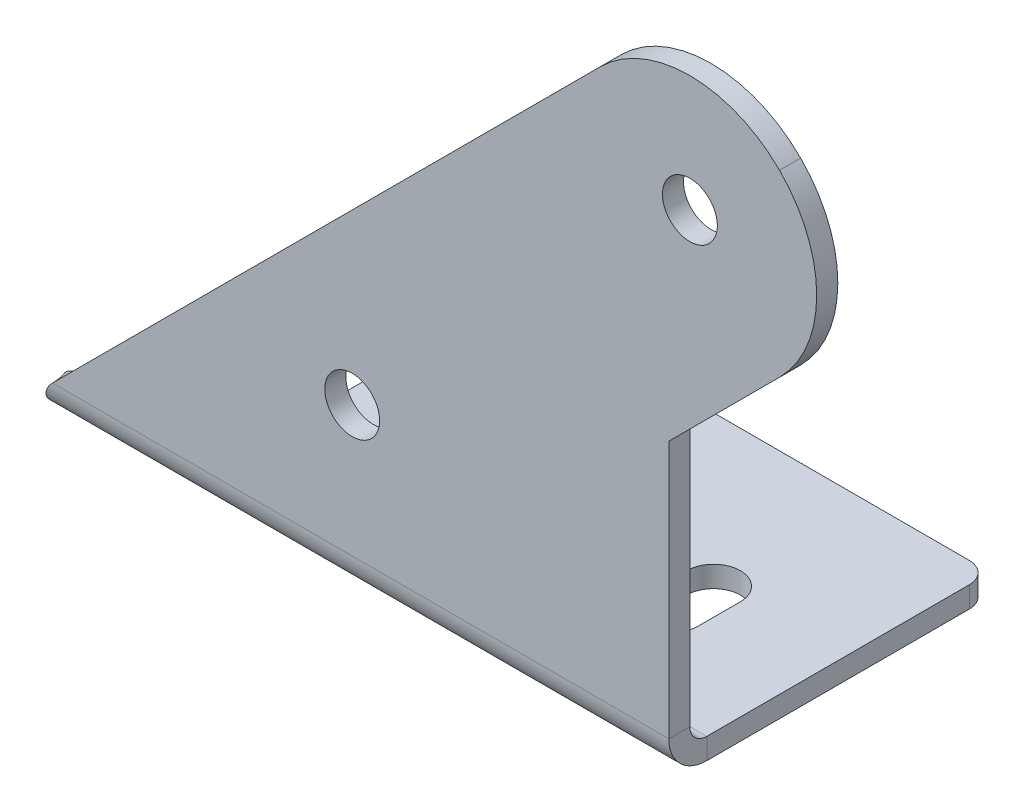
ISO-10303-21;
HEADER;
FILE_DESCRIPTION(('STEP AP214'),'2;1');
FILE_NAME('part.step','',(''),(''),'','','');
FILE_SCHEMA(('AUTOMOTIVE_DESIGN { 1 0 10303 214 1 1 1 1 }'));
ENDSEC;
DATA;
#1=APPLICATION_CONTEXT('core data for automotive mechanical design processes');
#2=APPLICATION_PROTOCOL_DEFINITION('international standard','automotive_design',2000,#1);
#3=PRODUCT_CONTEXT('',#1,'mechanical');
#4=PRODUCT('Part','Part','',(#3));
#5=PRODUCT_RELATED_PRODUCT_CATEGORY('part','',(#4));
#6=PRODUCT_DEFINITION_FORMATION('','',#4);
#7=PRODUCT_DEFINITION_CONTEXT('part definition',#1,'design');
#8=PRODUCT_DEFINITION('design','',#6,#7);
#9=PRODUCT_DEFINITION_SHAPE('','',#8);
#10=(LENGTH_UNIT() NAMED_UNIT(*) SI_UNIT(.MILLI.,.METRE.));
#11=(NAMED_UNIT(*) PLANE_ANGLE_UNIT() SI_UNIT($,.RADIAN.));
#12=(NAMED_UNIT(*) SI_UNIT($,.STERADIAN.) SOLID_ANGLE_UNIT());
#13=UNCERTAINTY_MEASURE_WITH_UNIT(LENGTH_MEASURE(1.E-05),#10,'distance_accuracy_value','');
#14=(GEOMETRIC_REPRESENTATION_CONTEXT(3) GLOBAL_UNCERTAINTY_ASSIGNED_CONTEXT((#13)) GLOBAL_UNIT_ASSIGNED_CONTEXT((#10,
#11,#12)) REPRESENTATION_CONTEXT('',''));
#15=CARTESIAN_POINT('',(0.,0.,0.));
#16=DIRECTION('',(0.,0.,1.));
#17=DIRECTION('',(1.,0.,0.));
#18=AXIS2_PLACEMENT_3D('',#15,#16,#17);
#19=CARTESIAN_POINT('',(45.,-5.,-35.6));
#20=DIRECTION('',(0.,-1.,0.));
#21=DIRECTION('',(0.,0.,-1.));
#22=AXIS2_PLACEMENT_3D('',#19,#20,#21);
#23=CYLINDRICAL_SURFACE('',#22,6.37253144016552);
#24=DIRECTION('',(0.,-1.,0.));
#25=VECTOR('',#24,1.);
#26=CARTESIAN_POINT('',(51.3725314401655,-5.,-35.6));
#27=LINE('',#26,#25);
#28=CARTESIAN_POINT('',(51.3725314401655,0.,-35.6));
#29=VERTEX_POINT('',#28);
#30=CARTESIAN_POINT('',(51.3725314401655,-5.,-35.6));
#31=VERTEX_POINT('',#30);
#32=EDGE_CURVE('E11',#29,#31,#27,.T.);
#33=ORIENTED_EDGE('',*,*,#32,.F.);
#34=CARTESIAN_POINT('',(45.,0.,-35.6));
#35=DIRECTION('',(0.,-1.,0.));
#36=DIRECTION('',(0.,0.,-1.));
#37=AXIS2_PLACEMENT_3D('',#34,#35,#36);
#38=CIRCLE('',#37,6.37253144016552);
#39=CARTESIAN_POINT('',(38.6274685598345,0.,-35.6));
#40=VERTEX_POINT('',#39);
#41=EDGE_CURVE('E150',#40,#29,#38,.T.);
#42=ORIENTED_EDGE('',*,*,#41,.F.);
#43=DIRECTION('',(0.,-1.,0.));
#44=VECTOR('',#43,1.);
#45=CARTESIAN_POINT('',(38.6274685598345,-5.,-35.6));
#46=LINE('',#45,#44);
#47=CARTESIAN_POINT('',(38.6274685598345,-5.,-35.6));
#48=VERTEX_POINT('',#47);
#49=EDGE_CURVE('E51',#40,#48,#46,.T.);
#50=ORIENTED_EDGE('',*,*,#49,.T.);
#51=CARTESIAN_POINT('',(45.,-5.,-35.6));
#52=DIRECTION('',(0.,-1.,0.));
#53=DIRECTION('',(0.,0.,-1.));
#54=AXIS2_PLACEMENT_3D('',#51,#52,#53);
#55=CIRCLE('',#54,6.37253144016552);
#56=EDGE_CURVE('E466',#48,#31,#55,.T.);
#57=ORIENTED_EDGE('',*,*,#56,.T.);
#58=EDGE_LOOP('',(#33,#42,#50,#57));
#59=FACE_BOUND('',#58,.T.);
#60=ADVANCED_FACE('F41',(#59),#23,.F.);
#61=CARTESIAN_POINT('',(38.6274685598345,-5.,-25.6));
#62=DIRECTION('',(1.,0.,0.));
#63=DIRECTION('',(0.,0.,-1.));
#64=AXIS2_PLACEMENT_3D('',#61,#62,#63);
#65=PLANE('',#64);
#66=ORIENTED_EDGE('',*,*,#49,.F.);
#67=DIRECTION('',(0.,0.,1.));
#68=VECTOR('',#67,1.);
#69=CARTESIAN_POINT('',(38.6274685598345,0.,-66.2));
#70=LINE('',#69,#68);
#71=CARTESIAN_POINT('',(38.6274685598345,0.,-25.6));
#72=VERTEX_POINT('',#71);
#73=EDGE_CURVE('E163',#72,#40,#70,.F.);
#74=ORIENTED_EDGE('',*,*,#73,.F.);
#75=DIRECTION('',(0.,-1.,0.));
#76=VECTOR('',#75,1.);
#77=CARTESIAN_POINT('',(38.6274685598345,-5.,-25.6));
#78=LINE('',#77,#76);
#79=CARTESIAN_POINT('',(38.6274685598345,-5.,-25.6));
#80=VERTEX_POINT('',#79);
#81=EDGE_CURVE('E142',#72,#80,#78,.T.);
#82=ORIENTED_EDGE('',*,*,#81,.T.);
#83=DIRECTION('',(0.,0.,-1.));
#84=VECTOR('',#83,1.);
#85=CARTESIAN_POINT('',(38.6274685598345,-5.,-25.6));
#86=LINE('',#85,#84);
#87=EDGE_CURVE('E463',#80,#48,#86,.T.);
#88=ORIENTED_EDGE('',*,*,#87,.T.);
#89=EDGE_LOOP('',(#66,#74,#82,#88));
#90=FACE_BOUND('',#89,.T.);
#91=ADVANCED_FACE('F360',(#90),#65,.T.);
#92=CARTESIAN_POINT('',(45.,-5.,-25.6));
#93=DIRECTION('',(0.,-1.,0.));
#94=DIRECTION('',(0.,0.,-1.));
#95=AXIS2_PLACEMENT_3D('',#92,#93,#94);
#96=CYLINDRICAL_SURFACE('',#95,6.37253144016552);
#97=ORIENTED_EDGE('',*,*,#81,.F.);
#98=CARTESIAN_POINT('',(45.,0.,-25.6));
#99=DIRECTION('',(0.,-1.,0.));
#100=DIRECTION('',(0.,0.,-1.));
#101=AXIS2_PLACEMENT_3D('',#98,#99,#100);
#102=CIRCLE('',#101,6.37253144016552);
#103=CARTESIAN_POINT('',(51.3725314401655,0.,-25.6));
#104=VERTEX_POINT('',#103);
#105=EDGE_CURVE('E148',#104,#72,#102,.T.);
#106=ORIENTED_EDGE('',*,*,#105,.F.);
#107=DIRECTION('',(0.,-1.,0.));
#108=VECTOR('',#107,1.);
#109=CARTESIAN_POINT('',(51.3725314401655,-5.,-25.6));
#110=LINE('',#109,#108);
#111=CARTESIAN_POINT('',(51.3725314401655,-5.,-25.6));
#112=VERTEX_POINT('',#111);
#113=EDGE_CURVE('E45',#104,#112,#110,.T.);
#114=ORIENTED_EDGE('',*,*,#113,.T.);
#115=CARTESIAN_POINT('',(45.,-5.,-25.6));
#116=DIRECTION('',(0.,-1.,0.));
#117=DIRECTION('',(0.,0.,-1.));
#118=AXIS2_PLACEMENT_3D('',#115,#116,#117);
#119=CIRCLE('',#118,6.37253144016552);
#120=EDGE_CURVE('E469',#112,#80,#119,.T.);
#121=ORIENTED_EDGE('',*,*,#120,.T.);
#122=EDGE_LOOP('',(#97,#106,#114,#121));
#123=FACE_BOUND('',#122,.T.);
#124=ADVANCED_FACE('F152',(#123),#96,.F.);
#125=CARTESIAN_POINT('',(-45.,-5.,-35.6));
#126=DIRECTION('',(0.,-1.,0.));
#127=DIRECTION('',(0.,0.,-1.));
#128=AXIS2_PLACEMENT_3D('',#125,#126,#127);
#129=CYLINDRICAL_SURFACE('',#128,6.51840468515784);
#130=DIRECTION('',(0.,-1.,0.));
#131=VECTOR('',#130,1.);
#132=CARTESIAN_POINT('',(-38.4815953148422,-5.,-35.6));
#133=LINE('',#132,#131);
#134=CARTESIAN_POINT('',(-38.4815953148422,0.,-35.6));
#135=VERTEX_POINT('',#134);
#136=CARTESIAN_POINT('',(-38.4815953148422,-5.,-35.6));
#137=VERTEX_POINT('',#136);
#138=EDGE_CURVE('E143',#135,#137,#133,.T.);
#139=ORIENTED_EDGE('',*,*,#138,.F.);
#140=CARTESIAN_POINT('',(-45.,0.,-35.6));
#141=DIRECTION('',(0.,-1.,0.));
#142=DIRECTION('',(0.,0.,-1.));
#143=AXIS2_PLACEMENT_3D('',#140,#141,#142);
#144=CIRCLE('',#143,6.51840468515784);
#145=CARTESIAN_POINT('',(-51.5184046851578,0.,-35.6));
#146=VERTEX_POINT('',#145);
#147=EDGE_CURVE('E410',#146,#135,#144,.T.);
#148=ORIENTED_EDGE('',*,*,#147,.F.);
#149=DIRECTION('',(0.,-1.,0.));
#150=VECTOR('',#149,1.);
#151=CARTESIAN_POINT('',(-51.5184046851578,-5.,-35.6));
#152=LINE('',#151,#150);
#153=CARTESIAN_POINT('',(-51.5184046851578,-5.,-35.6));
#154=VERTEX_POINT('',#153);
#155=EDGE_CURVE('E396',#146,#154,#152,.T.);
#156=ORIENTED_EDGE('',*,*,#155,.T.);
#157=CARTESIAN_POINT('',(-45.,-5.,-35.6));
#158=DIRECTION('',(0.,-1.,0.));
#159=DIRECTION('',(0.,0.,-1.));
#160=AXIS2_PLACEMENT_3D('',#157,#158,#159);
#161=CIRCLE('',#160,6.51840468515784);
#162=EDGE_CURVE('E485',#154,#137,#161,.T.);
#163=ORIENTED_EDGE('',*,*,#162,.T.);
#164=EDGE_LOOP('',(#139,#148,#156,#163));
#165=FACE_BOUND('',#164,.T.);
#166=ADVANCED_FACE('F369',(#165),#129,.F.);
#167=CARTESIAN_POINT('',(-51.5184046851578,-5.,-25.6));
#168=DIRECTION('',(1.,0.,0.));
#169=DIRECTION('',(0.,0.,-1.));
#170=AXIS2_PLACEMENT_3D('',#167,#168,#169);
#171=PLANE('',#170);
#172=ORIENTED_EDGE('',*,*,#155,.F.);
#173=DIRECTION('',(0.,0.,1.));
#174=VECTOR('',#173,1.);
#175=CARTESIAN_POINT('',(-51.5184046851578,0.,-66.2));
#176=LINE('',#175,#174);
#177=CARTESIAN_POINT('',(-51.5184046851578,0.,-25.6));
#178=VERTEX_POINT('',#177);
#179=EDGE_CURVE('E404',#178,#146,#176,.F.);
#180=ORIENTED_EDGE('',*,*,#179,.F.);
#181=DIRECTION('',(0.,-1.,0.));
#182=VECTOR('',#181,1.);
#183=CARTESIAN_POINT('',(-51.5184046851578,-5.,-25.6));
#184=LINE('',#183,#182);
#185=CARTESIAN_POINT('',(-51.5184046851578,-5.,-25.6));
#186=VERTEX_POINT('',#185);
#187=EDGE_CURVE('E386',#178,#186,#184,.T.);
#188=ORIENTED_EDGE('',*,*,#187,.T.);
#189=DIRECTION('',(0.,0.,-1.));
#190=VECTOR('',#189,1.);
#191=CARTESIAN_POINT('',(-51.5184046851578,-5.,-25.6));
#192=LINE('',#191,#190);
#193=EDGE_CURVE('E483',#186,#154,#192,.T.);
#194=ORIENTED_EDGE('',*,*,#193,.T.);
#195=EDGE_LOOP('',(#172,#180,#188,#194));
#196=FACE_BOUND('',#195,.T.);
#197=ADVANCED_FACE('F375',(#196),#171,.T.);
#198=CARTESIAN_POINT('',(-45.,-5.,-25.6));
#199=DIRECTION('',(0.,-1.,0.));
#200=DIRECTION('',(0.,0.,-1.));
#201=AXIS2_PLACEMENT_3D('',#198,#199,#200);
#202=CYLINDRICAL_SURFACE('',#201,6.51840468515784);
#203=ORIENTED_EDGE('',*,*,#187,.F.);
#204=CARTESIAN_POINT('',(-45.,0.,-25.6));
#205=DIRECTION('',(0.,-1.,0.));
#206=DIRECTION('',(0.,0.,-1.));
#207=AXIS2_PLACEMENT_3D('',#204,#205,#206);
#208=CIRCLE('',#207,6.51840468515784);
#209=CARTESIAN_POINT('',(-38.4815953148422,0.,-25.6));
#210=VERTEX_POINT('',#209);
#211=EDGE_CURVE('E389',#210,#178,#208,.T.);
#212=ORIENTED_EDGE('',*,*,#211,.F.);
#213=DIRECTION('',(0.,-1.,0.));
#214=VECTOR('',#213,1.);
#215=CARTESIAN_POINT('',(-38.4815953148422,-5.,-25.6));
#216=LINE('',#215,#214);
#217=CARTESIAN_POINT('',(-38.4815953148422,-5.,-25.6));
#218=VERTEX_POINT('',#217);
#219=EDGE_CURVE('E397',#210,#218,#216,.T.);
#220=ORIENTED_EDGE('',*,*,#219,.T.);
#221=CARTESIAN_POINT('',(-45.,-5.,-25.6));
#222=DIRECTION('',(0.,-1.,0.));
#223=DIRECTION('',(0.,0.,-1.));
#224=AXIS2_PLACEMENT_3D('',#221,#222,#223);
#225=CIRCLE('',#224,6.51840468515784);
#226=EDGE_CURVE('E392',#218,#186,#225,.T.);
#227=ORIENTED_EDGE('',*,*,#226,.T.);
#228=EDGE_LOOP('',(#203,#212,#220,#227));
#229=FACE_BOUND('',#228,.T.);
#230=ADVANCED_FACE('F358',(#229),#202,.F.);
#231=CARTESIAN_POINT('',(-75.,-5.,-66.2));
#232=DIRECTION('',(1.,0.,0.));
#233=DIRECTION('',(0.,0.,-1.));
#234=AXIS2_PLACEMENT_3D('',#231,#232,#233);
#235=PLANE('',#234);
#236=CARTESIAN_POINT('',(-75.,0.,-4.));
#237=CARTESIAN_POINT('',(-75.,-5.,-4.00000000000001));
#238=B_SPLINE_CURVE_WITH_KNOTS('',1,(#236,#237),.UNSPECIFIED.,.F.,.F.,(2,2),(0.,1.),.UNSPECIFIED.);
#239=CARTESIAN_POINT('',(-75.,0.,-4.));
#240=VERTEX_POINT('',#239);
#241=CARTESIAN_POINT('',(-75.,-5.,-4.));
#242=VERTEX_POINT('',#241);
#243=EDGE_CURVE('E289',#240,#242,#238,.T.);
#244=ORIENTED_EDGE('',*,*,#243,.F.);
#245=DIRECTION('',(0.,0.,1.));
#246=VECTOR('',#245,1.);
#247=CARTESIAN_POINT('',(-75.,0.,-66.2));
#248=LINE('',#247,#246);
#249=CARTESIAN_POINT('',(-75.,0.,-66.2));
#250=VERTEX_POINT('',#249);
#251=EDGE_CURVE('E174',#240,#250,#248,.F.);
#252=ORIENTED_EDGE('',*,*,#251,.T.);
#253=DIRECTION('',(0.,-1.,0.));
#254=VECTOR('',#253,1.);
#255=CARTESIAN_POINT('',(-75.,-5.,-66.2));
#256=LINE('',#255,#254);
#257=CARTESIAN_POINT('',(-75.,-5.,-66.2));
#258=VERTEX_POINT('',#257);
#259=EDGE_CURVE('E540',#250,#258,#256,.T.);
#260=ORIENTED_EDGE('',*,*,#259,.T.);
#261=DIRECTION('',(0.,0.,-1.));
#262=VECTOR('',#261,1.);
#263=CARTESIAN_POINT('',(-75.,-5.,-66.2));
#264=LINE('',#263,#262);
#265=EDGE_CURVE('E185',#242,#258,#264,.T.);
#266=ORIENTED_EDGE('',*,*,#265,.F.);
#267=EDGE_LOOP('',(#244,#252,#260,#266));
#268=FACE_BOUND('',#267,.T.);
#269=ADVANCED_FACE('F259',(#268),#235,.F.);
#270=CARTESIAN_POINT('',(-70.,-5.,-66.2));
#271=DIRECTION('',(0.,-1.,0.));
#272=DIRECTION('',(0.,0.,-1.));
#273=AXIS2_PLACEMENT_3D('',#270,#271,#272);
#274=CYLINDRICAL_SURFACE('',#273,5.);
#275=ORIENTED_EDGE('',*,*,#259,.F.);
#276=CARTESIAN_POINT('',(-70.,0.,-66.2));
#277=DIRECTION('',(0.,-1.,0.));
#278=DIRECTION('',(0.,0.,-1.));
#279=AXIS2_PLACEMENT_3D('',#276,#277,#278);
#280=CIRCLE('',#279,5.);
#281=CARTESIAN_POINT('',(-70.,0.,-71.2));
#282=VERTEX_POINT('',#281);
#283=EDGE_CURVE('E177',#250,#282,#280,.T.);
#284=ORIENTED_EDGE('',*,*,#283,.T.);
#285=DIRECTION('',(0.,-1.,0.));
#286=VECTOR('',#285,1.);
#287=CARTESIAN_POINT('',(-70.,-5.,-71.2));
#288=LINE('',#287,#286);
#289=CARTESIAN_POINT('',(-70.,-5.,-71.2));
#290=VERTEX_POINT('',#289);
#291=EDGE_CURVE('E588',#282,#290,#288,.T.);
#292=ORIENTED_EDGE('',*,*,#291,.T.);
#293=CARTESIAN_POINT('',(-70.,-5.,-66.2));
#294=DIRECTION('',(0.,-1.,0.));
#295=DIRECTION('',(0.,0.,1.));
#296=AXIS2_PLACEMENT_3D('',#293,#294,#295);
#297=CIRCLE('',#296,5.);
#298=EDGE_CURVE('E477',#258,#290,#297,.T.);
#299=ORIENTED_EDGE('',*,*,#298,.F.);
#300=EDGE_LOOP('',(#275,#284,#292,#299));
#301=FACE_BOUND('',#300,.T.);
#302=ADVANCED_FACE('F351',(#301),#274,.T.);
#303=CARTESIAN_POINT('',(-70.,-5.,-71.2));
#304=DIRECTION('',(0.,0.,1.));
#305=DIRECTION('',(1.,0.,0.));
#306=AXIS2_PLACEMENT_3D('',#303,#304,#305);
#307=PLANE('',#306);
#308=ORIENTED_EDGE('',*,*,#291,.F.);
#309=DIRECTION('',(1.,0.,0.));
#310=VECTOR('',#309,1.);
#311=CARTESIAN_POINT('',(-70.,0.,-71.2));
#312=LINE('',#311,#310);
#313=CARTESIAN_POINT('',(70.,0.,-71.2));
#314=VERTEX_POINT('',#313);
#315=EDGE_CURVE('E157',#282,#314,#312,.T.);
#316=ORIENTED_EDGE('',*,*,#315,.T.);
#317=DIRECTION('',(0.,-1.,0.));
#318=VECTOR('',#317,1.);
#319=CARTESIAN_POINT('',(70.,-5.,-71.2));
#320=LINE('',#319,#318);
#321=CARTESIAN_POINT('',(70.,-5.,-71.2));
#322=VERTEX_POINT('',#321);
#323=EDGE_CURVE('E585',#314,#322,#320,.T.);
#324=ORIENTED_EDGE('',*,*,#323,.T.);
#325=DIRECTION('',(1.,0.,0.));
#326=VECTOR('',#325,1.);
#327=CARTESIAN_POINT('',(-70.,-5.,-71.2));
#328=LINE('',#327,#326);
#329=EDGE_CURVE('E474',#290,#322,#328,.T.);
#330=ORIENTED_EDGE('',*,*,#329,.F.);
#331=EDGE_LOOP('',(#308,#316,#324,#330));
#332=FACE_BOUND('',#331,.T.);
#333=ADVANCED_FACE('F348',(#332),#307,.F.);
#334=CARTESIAN_POINT('',(70.,-5.,-66.2));
#335=DIRECTION('',(0.,-1.,0.));
#336=DIRECTION('',(0.,0.,-1.));
#337=AXIS2_PLACEMENT_3D('',#334,#335,#336);
#338=CYLINDRICAL_SURFACE('',#337,5.);
#339=ORIENTED_EDGE('',*,*,#323,.F.);
#340=CARTESIAN_POINT('',(70.,0.,-66.2));
#341=DIRECTION('',(0.,-1.,0.));
#342=DIRECTION('',(0.,0.,-1.));
#343=AXIS2_PLACEMENT_3D('',#340,#341,#342);
#344=CIRCLE('',#343,5.);
#345=CARTESIAN_POINT('',(75.,0.,-66.2));
#346=VERTEX_POINT('',#345);
#347=EDGE_CURVE('E154',#314,#346,#344,.T.);
#348=ORIENTED_EDGE('',*,*,#347,.T.);
#349=DIRECTION('',(0.,-1.,0.));
#350=VECTOR('',#349,1.);
#351=CARTESIAN_POINT('',(75.,-5.,-66.2));
#352=LINE('',#351,#350);
#353=CARTESIAN_POINT('',(75.,-5.,-66.2));
#354=VERTEX_POINT('',#353);
#355=EDGE_CURVE('E583',#346,#354,#352,.T.);
#356=ORIENTED_EDGE('',*,*,#355,.T.);
#357=CARTESIAN_POINT('',(70.,-5.,-66.2));
#358=DIRECTION('',(0.,-1.,0.));
#359=DIRECTION('',(0.,0.,-1.));
#360=AXIS2_PLACEMENT_3D('',#357,#358,#359);
#361=CIRCLE('',#360,5.);
#362=EDGE_CURVE('E471',#322,#354,#361,.T.);
#363=ORIENTED_EDGE('',*,*,#362,.F.);
#364=EDGE_LOOP('',(#339,#348,#356,#363));
#365=FACE_BOUND('',#364,.T.);
#366=ADVANCED_FACE('F344',(#365),#338,.T.);
#367=CARTESIAN_POINT('',(75.,-5.,-66.2));
#368=DIRECTION('',(-1.,0.,0.));
#369=DIRECTION('',(0.,0.,1.));
#370=AXIS2_PLACEMENT_3D('',#367,#368,#369);
#371=PLANE('',#370);
#372=ORIENTED_EDGE('',*,*,#355,.F.);
#373=DIRECTION('',(0.,0.,1.));
#374=VECTOR('',#373,1.);
#375=CARTESIAN_POINT('',(75.,0.,-66.2));
#376=LINE('',#375,#374);
#377=CARTESIAN_POINT('',(75.,0.,-4.));
#378=VERTEX_POINT('',#377);
#379=EDGE_CURVE('E178',#346,#378,#376,.T.);
#380=ORIENTED_EDGE('',*,*,#379,.T.);
#381=DIRECTION('',(0.,-1.,0.));
#382=VECTOR('',#381,1.);
#383=CARTESIAN_POINT('',(75.,-5.,-4.));
#384=LINE('',#383,#382);
#385=CARTESIAN_POINT('',(75.,-5.,-4.));
#386=VERTEX_POINT('',#385);
#387=EDGE_CURVE('E581',#378,#386,#384,.T.);
#388=ORIENTED_EDGE('',*,*,#387,.T.);
#389=DIRECTION('',(0.,0.,1.));
#390=VECTOR('',#389,1.);
#391=CARTESIAN_POINT('',(75.,-5.,-66.2));
#392=LINE('',#391,#390);
#393=EDGE_CURVE('E480',#354,#386,#392,.T.);
#394=ORIENTED_EDGE('',*,*,#393,.F.);
#395=EDGE_LOOP('',(#372,#380,#388,#394));
#396=FACE_BOUND('',#395,.T.);
#397=ADVANCED_FACE('F341',(#396),#371,.F.);
#398=CARTESIAN_POINT('',(75.,4.,-4.));
#399=DIRECTION('',(-1.,0.,0.));
#400=DIRECTION('',(0.,0.,1.));
#401=AXIS2_PLACEMENT_3D('',#398,#399,#400);
#402=PLANE('',#401);
#403=ORIENTED_EDGE('',*,*,#387,.F.);
#404=CARTESIAN_POINT('',(75.,4.,-4.));
#405=DIRECTION('',(-1.,0.,0.));
#406=DIRECTION('',(0.,0.,1.));
#407=AXIS2_PLACEMENT_3D('',#404,#405,#406);
#408=CIRCLE('',#407,4.);
#409=CARTESIAN_POINT('',(75.,4.,0.));
#410=VERTEX_POINT('',#409);
#411=EDGE_CURVE('E406',#378,#410,#408,.T.);
#412=ORIENTED_EDGE('',*,*,#411,.T.);
#413=DIRECTION('',(0.,0.,1.));
#414=VECTOR('',#413,1.);
#415=CARTESIAN_POINT('',(75.,4.,5.));
#416=LINE('',#415,#414);
#417=CARTESIAN_POINT('',(75.,4.,5.));
#418=VERTEX_POINT('',#417);
#419=EDGE_CURVE('E59',#410,#418,#416,.T.);
#420=ORIENTED_EDGE('',*,*,#419,.T.);
#421=CARTESIAN_POINT('',(75.,4.,-4.));
#422=DIRECTION('',(1.,0.,0.));
#423=DIRECTION('',(0.,0.,-1.));
#424=AXIS2_PLACEMENT_3D('',#421,#422,#423);
#425=CIRCLE('',#424,9.);
#426=EDGE_CURVE('E438',#386,#418,#425,.F.);
#427=ORIENTED_EDGE('',*,*,#426,.F.);
#428=EDGE_LOOP('',(#403,#412,#420,#427));
#429=FACE_BOUND('',#428,.T.);
#430=ADVANCED_FACE('F337',(#429),#402,.F.);
#431=CARTESIAN_POINT('',(75.,-5.,5.));
#432=DIRECTION('',(-1.,0.,0.));
#433=DIRECTION('',(0.,1.,0.));
#434=AXIS2_PLACEMENT_3D('',#431,#432,#433);
#435=PLANE('',#434);
#436=ORIENTED_EDGE('',*,*,#419,.F.);
#437=DIRECTION('',(0.,1.,0.));
#438=VECTOR('',#437,1.);
#439=CARTESIAN_POINT('',(75.,32.5735931288073,0.));
#440=LINE('',#439,#438);
#441=CARTESIAN_POINT('',(75.,65.0472719955607,0.));
#442=VERTEX_POINT('',#441);
#443=EDGE_CURVE('E229',#410,#442,#440,.T.);
#444=ORIENTED_EDGE('',*,*,#443,.T.);
#445=DIRECTION('',(0.,0.,1.));
#446=VECTOR('',#445,1.);
#447=CARTESIAN_POINT('',(75.,65.0472719955607,5.));
#448=LINE('',#447,#446);
#449=CARTESIAN_POINT('',(75.,65.0472719955607,5.));
#450=VERTEX_POINT('',#449);
#451=EDGE_CURVE('E578',#442,#450,#448,.T.);
#452=ORIENTED_EDGE('',*,*,#451,.T.);
#453=DIRECTION('',(0.,1.,0.));
#454=VECTOR('',#453,1.);
#455=CARTESIAN_POINT('',(75.,-5.,5.));
#456=LINE('',#455,#454);
#457=EDGE_CURVE('E453',#418,#450,#456,.T.);
#458=ORIENTED_EDGE('',*,*,#457,.F.);
#459=EDGE_LOOP('',(#436,#444,#452,#458));
#460=FACE_BOUND('',#459,.T.);
#461=ADVANCED_FACE('F333',(#460),#435,.F.);
#462=CARTESIAN_POINT('',(4.97636400221954,-4.97636400221955,5.));
#463=DIRECTION('',(0.707106781186546,-0.707106781186549,0.));
#464=DIRECTION('',(-0.707106781186549,-0.707106781186546,0.));
#465=AXIS2_PLACEMENT_3D('',#462,#463,#464);
#466=PLANE('',#465);
#467=ORIENTED_EDGE('',*,*,#451,.F.);
#468=DIRECTION('',(-0.707106781186549,-0.707106781186546,0.));
#469=VECTOR('',#468,1.);
#470=CARTESIAN_POINT('',(4.97636400221954,-4.97636400221955,0.));
#471=LINE('',#470,#469);
#472=CARTESIAN_POINT('',(101.263160566622,91.3104325621828,0.));
#473=VERTEX_POINT('',#472);
#474=EDGE_CURVE('E426',#473,#442,#471,.T.);
#475=ORIENTED_EDGE('',*,*,#474,.F.);
#476=DIRECTION('',(0.,0.,1.));
#477=VECTOR('',#476,1.);
#478=CARTESIAN_POINT('',(101.263160566622,91.3104325621828,5.));
#479=LINE('',#478,#477);
#480=CARTESIAN_POINT('',(101.263160566622,91.3104325621828,5.));
#481=VERTEX_POINT('',#480);
#482=EDGE_CURVE('E574',#473,#481,#479,.T.);
#483=ORIENTED_EDGE('',*,*,#482,.T.);
#484=DIRECTION('',(-0.707106781186549,-0.707106781186546,0.));
#485=VECTOR('',#484,1.);
#486=CARTESIAN_POINT('',(4.97636400221954,-4.97636400221955,5.));
#487=LINE('',#486,#485);
#488=EDGE_CURVE('E450',#481,#450,#487,.T.);
#489=ORIENTED_EDGE('',*,*,#488,.T.);
#490=EDGE_LOOP('',(#467,#475,#483,#489));
#491=FACE_BOUND('',#490,.T.);
#492=ADVANCED_FACE('F329',(#491),#466,.T.);
#493=CARTESIAN_POINT('',(80.0499571310259,112.523635997779,5.));
#494=DIRECTION('',(0.,0.,-1.));
#495=DIRECTION('',(-1.,0.,0.));
#496=AXIS2_PLACEMENT_3D('',#493,#494,#495);
#497=CYLINDRICAL_SURFACE('',#496,30.);
#498=ORIENTED_EDGE('',*,*,#482,.F.);
#499=CARTESIAN_POINT('',(80.0499571310259,112.523635997779,0.));
#500=DIRECTION('',(0.,0.,-1.));
#501=DIRECTION('',(-1.,0.,0.));
#502=AXIS2_PLACEMENT_3D('',#499,#500,#501);
#503=CIRCLE('',#502,30.);
#504=CARTESIAN_POINT('',(101.263160566622,133.736839433376,0.));
#505=VERTEX_POINT('',#504);
#506=EDGE_CURVE('E429',#505,#473,#503,.T.);
#507=ORIENTED_EDGE('',*,*,#506,.F.);
#508=DIRECTION('',(0.,0.,1.));
#509=VECTOR('',#508,1.);
#510=CARTESIAN_POINT('',(101.263160566622,133.736839433376,5.));
#511=LINE('',#510,#509);
#512=CARTESIAN_POINT('',(101.263160566622,133.736839433376,5.));
#513=VERTEX_POINT('',#512);
#514=EDGE_CURVE('E572',#505,#513,#511,.T.);
#515=ORIENTED_EDGE('',*,*,#514,.T.);
#516=CARTESIAN_POINT('',(80.0499571310259,112.523635997779,5.));
#517=DIRECTION('',(0.,0.,-1.));
#518=DIRECTION('',(-1.,0.,0.));
#519=AXIS2_PLACEMENT_3D('',#516,#517,#518);
#520=CIRCLE('',#519,30.);
#521=EDGE_CURVE('E447',#513,#481,#520,.T.);
#522=ORIENTED_EDGE('',*,*,#521,.T.);
#523=EDGE_LOOP('',(#498,#507,#515,#522));
#524=FACE_BOUND('',#523,.T.);
#525=ADVANCED_FACE('F325',(#524),#497,.T.);
#526=CARTESIAN_POINT('',(117.499999999999,117.499999999999,5.));
#527=DIRECTION('',(0.707106781186548,0.707106781186548,0.));
#528=DIRECTION('',(0.707106781186548,-0.707106781186548,0.));
#529=AXIS2_PLACEMENT_3D('',#526,#527,#528);
#530=PLANE('',#529);
#531=ORIENTED_EDGE('',*,*,#514,.F.);
#532=DIRECTION('',(0.707106781186548,-0.707106781186548,0.));
#533=VECTOR('',#532,1.);
#534=CARTESIAN_POINT('',(117.499999999999,117.499999999999,0.));
#535=LINE('',#534,#533);
#536=CARTESIAN_POINT('',(101.213203435596,133.786796564402,0.));
#537=VERTEX_POINT('',#536);
#538=EDGE_CURVE('E417',#537,#505,#535,.T.);
#539=ORIENTED_EDGE('',*,*,#538,.F.);
#540=DIRECTION('',(0.,0.,1.));
#541=VECTOR('',#540,1.);
#542=CARTESIAN_POINT('',(101.213203435596,133.786796564402,5.));
#543=LINE('',#542,#541);
#544=CARTESIAN_POINT('',(101.213203435596,133.786796564402,5.));
#545=VERTEX_POINT('',#544);
#546=EDGE_CURVE('E566',#537,#545,#543,.T.);
#547=ORIENTED_EDGE('',*,*,#546,.T.);
#548=DIRECTION('',(0.707106781186548,-0.707106781186548,0.));
#549=VECTOR('',#548,1.);
#550=CARTESIAN_POINT('',(117.499999999999,117.499999999999,5.));
#551=LINE('',#550,#549);
#552=EDGE_CURVE('E444',#545,#513,#551,.T.);
#553=ORIENTED_EDGE('',*,*,#552,.T.);
#554=EDGE_LOOP('',(#531,#539,#547,#553));
#555=FACE_BOUND('',#554,.T.);
#556=ADVANCED_FACE('F321',(#555),#530,.T.);
#557=CARTESIAN_POINT('',(79.9999999999998,112.573593128806,5.));
#558=DIRECTION('',(0.,0.,-1.));
#559=DIRECTION('',(-1.,0.,0.));
#560=AXIS2_PLACEMENT_3D('',#557,#558,#559);
#561=CYLINDRICAL_SURFACE('',#560,30.);
#562=ORIENTED_EDGE('',*,*,#546,.F.);
#563=CARTESIAN_POINT('',(79.9999999999998,112.573593128806,0.));
#564=DIRECTION('',(0.,0.,-1.));
#565=DIRECTION('',(-1.,0.,0.));
#566=AXIS2_PLACEMENT_3D('',#563,#564,#565);
#567=CIRCLE('',#566,30.);
#568=CARTESIAN_POINT('',(58.7867965644033,133.786796564402,0.));
#569=VERTEX_POINT('',#568);
#570=EDGE_CURVE('E230',#569,#537,#567,.T.);
#571=ORIENTED_EDGE('',*,*,#570,.F.);
#572=DIRECTION('',(0.,0.,1.));
#573=VECTOR('',#572,1.);
#574=CARTESIAN_POINT('',(58.7867965644033,133.786796564402,5.));
#575=LINE('',#574,#573);
#576=CARTESIAN_POINT('',(58.7867965644033,133.786796564402,5.));
#577=VERTEX_POINT('',#576);
#578=EDGE_CURVE('E557',#569,#577,#575,.T.);
#579=ORIENTED_EDGE('',*,*,#578,.T.);
#580=CARTESIAN_POINT('',(79.9999999999998,112.573593128806,5.));
#581=DIRECTION('',(0.,0.,-1.));
#582=DIRECTION('',(-1.,0.,0.));
#583=AXIS2_PLACEMENT_3D('',#580,#581,#582);
#584=CIRCLE('',#583,30.);
#585=EDGE_CURVE('E457',#577,#545,#584,.T.);
#586=ORIENTED_EDGE('',*,*,#585,.T.);
#587=EDGE_LOOP('',(#562,#571,#579,#586));
#588=FACE_BOUND('',#587,.T.);
#589=ADVANCED_FACE('F318',(#588),#561,.T.);
#590=CARTESIAN_POINT('',(-75.,0.,5.));
#591=DIRECTION('',(0.707106781186549,-0.707106781186546,0.));
#592=DIRECTION('',(-0.707106781186546,-0.707106781186549,0.));
#593=AXIS2_PLACEMENT_3D('',#590,#591,#592);
#594=PLANE('',#593);
#595=ORIENTED_EDGE('',*,*,#578,.F.);
#596=DIRECTION('',(-0.707106781186546,-0.707106781186549,0.));
#597=VECTOR('',#596,1.);
#598=CARTESIAN_POINT('',(-75.,0.,0.));
#599=LINE('',#598,#597);
#600=CARTESIAN_POINT('',(-71.,4.,0.));
#601=VERTEX_POINT('',#600);
#602=EDGE_CURVE('E226',#569,#601,#599,.T.);
#603=ORIENTED_EDGE('',*,*,#602,.T.);
#604=CARTESIAN_POINT('',(-71.,4.,5.));
#605=CARTESIAN_POINT('',(-71.,4.,0.));
#606=B_SPLINE_CURVE_WITH_KNOTS('',1,(#604,#605),.UNSPECIFIED.,.F.,.F.,(2,2),(0.,1.),.UNSPECIFIED.);
#607=CARTESIAN_POINT('',(-71.,4.,5.));
#608=VERTEX_POINT('',#607);
#609=EDGE_CURVE('E301',#601,#608,#606,.F.);
#610=ORIENTED_EDGE('',*,*,#609,.T.);
#611=DIRECTION('',(-0.707106781186546,-0.707106781186549,0.));
#612=VECTOR('',#611,1.);
#613=CARTESIAN_POINT('',(-75.,0.,5.));
#614=LINE('',#613,#612);
#615=EDGE_CURVE('E456',#577,#608,#614,.T.);
#616=ORIENTED_EDGE('',*,*,#615,.F.);
#617=EDGE_LOOP('',(#595,#603,#610,#616));
#618=FACE_BOUND('',#617,.T.);
#619=ADVANCED_FACE('F307',(#618),#594,.F.);
#620=CARTESIAN_POINT('',(-38.4815953148422,-5.,-25.6));
#621=DIRECTION('',(-1.,0.,0.));
#622=DIRECTION('',(0.,0.,1.));
#623=AXIS2_PLACEMENT_3D('',#620,#621,#622);
#624=PLANE('',#623);
#625=DIRECTION('',(0.,0.,1.));
#626=VECTOR('',#625,1.);
#627=CARTESIAN_POINT('',(-38.4815953148422,0.,-66.2));
#628=LINE('',#627,#626);
#629=EDGE_CURVE('E161',#135,#210,#628,.T.);
#630=ORIENTED_EDGE('',*,*,#629,.F.);
#631=ORIENTED_EDGE('',*,*,#138,.T.);
#632=DIRECTION('',(0.,0.,1.));
#633=VECTOR('',#632,1.);
#634=CARTESIAN_POINT('',(-38.4815953148422,-5.,-25.6));
#635=LINE('',#634,#633);
#636=EDGE_CURVE('E488',#137,#218,#635,.T.);
#637=ORIENTED_EDGE('',*,*,#636,.T.);
#638=ORIENTED_EDGE('',*,*,#219,.F.);
#639=EDGE_LOOP('',(#630,#631,#637,#638));
#640=FACE_BOUND('',#639,.T.);
#641=ADVANCED_FACE('F317',(#640),#624,.T.);
#642=CARTESIAN_POINT('',(51.3725314401655,-5.,-25.6));
#643=DIRECTION('',(-1.,0.,0.));
#644=DIRECTION('',(0.,0.,1.));
#645=AXIS2_PLACEMENT_3D('',#642,#643,#644);
#646=PLANE('',#645);
#647=DIRECTION('',(0.,0.,1.));
#648=VECTOR('',#647,1.);
#649=CARTESIAN_POINT('',(51.3725314401655,0.,-66.2));
#650=LINE('',#649,#648);
#651=EDGE_CURVE('E134',#29,#104,#650,.T.);
#652=ORIENTED_EDGE('',*,*,#651,.F.);
#653=ORIENTED_EDGE('',*,*,#32,.T.);
#654=DIRECTION('',(0.,0.,1.));
#655=VECTOR('',#654,1.);
#656=CARTESIAN_POINT('',(51.3725314401655,-5.,-25.6));
#657=LINE('',#656,#655);
#658=EDGE_CURVE('E137',#31,#112,#657,.T.);
#659=ORIENTED_EDGE('',*,*,#658,.T.);
#660=ORIENTED_EDGE('',*,*,#113,.F.);
#661=EDGE_LOOP('',(#652,#653,#659,#660));
#662=FACE_BOUND('',#661,.T.);
#663=ADVANCED_FACE('F43',(#662),#646,.T.);
#664=CARTESIAN_POINT('',(0.,35.,5.));
#665=DIRECTION('',(0.,0.,1.));
#666=DIRECTION('',(1.,0.,0.));
#667=AXIS2_PLACEMENT_3D('',#664,#665,#666);
#668=CYLINDRICAL_SURFACE('',#667,6.5);
#669=CARTESIAN_POINT('',(0.,35.,5.));
#670=DIRECTION('',(0.,0.,1.));
#671=DIRECTION('',(1.,0.,0.));
#672=AXIS2_PLACEMENT_3D('',#669,#670,#671);
#673=CIRCLE('',#672,6.5);
#674=CARTESIAN_POINT('',(6.5,35.,5.));
#675=VERTEX_POINT('',#674);
#676=EDGE_CURVE('E460',#675,#675,#673,.T.);
#677=ORIENTED_EDGE('',*,*,#676,.T.);
#678=EDGE_LOOP('',(#677));
#679=FACE_BOUND('',#678,.T.);
#680=CARTESIAN_POINT('',(0.,35.,0.));
#681=DIRECTION('',(0.,0.,1.));
#682=DIRECTION('',(1.,0.,0.));
#683=AXIS2_PLACEMENT_3D('',#680,#681,#682);
#684=CIRCLE('',#683,6.5);
#685=CARTESIAN_POINT('',(6.5,35.,0.));
#686=VERTEX_POINT('',#685);
#687=EDGE_CURVE('E165',#686,#686,#684,.T.);
#688=ORIENTED_EDGE('',*,*,#687,.F.);
#689=EDGE_LOOP('',(#688));
#690=FACE_BOUND('',#689,.T.);
#691=ADVANCED_FACE('F258',(#679,#690),#668,.F.);
#692=CARTESIAN_POINT('',(-75.,-5.,-4.00000000000001));
#693=CARTESIAN_POINT('',(-75.,-5.,-3.44426559501305));
#694=CARTESIAN_POINT('',(-74.9866353183961,-4.94772749740286,-2.8549407183733));
#695=CARTESIAN_POINT('',(-74.9275751031836,-4.71100842236441,-1.65664334944185));
#696=CARTESIAN_POINT('',(-74.8818795695748,-4.52639216125536,-1.04780303141598));
#697=CARTESIAN_POINT('',(-74.7525561615555,-4.0191164599682,0.136254517108513));
#698=CARTESIAN_POINT('',(-74.6689282871448,-3.69647986215215,0.711099063231658));
#699=CARTESIAN_POINT('',(-74.4581387087245,-2.93206556693464,1.77725917956039));
#700=CARTESIAN_POINT('',(-74.3309770047148,-2.49050734854171,2.26825753066825));
#701=CARTESIAN_POINT('',(-74.0275182782993,-1.52822544117498,3.13137164813326));
#702=CARTESIAN_POINT('',(-73.8512212558935,-1.00784428079193,3.50333320162896));
#703=CARTESIAN_POINT('',(-73.4438904038887,0.0598164305785448,4.11501490538305));
#704=CARTESIAN_POINT('',(-73.2128565742896,0.606751466611356,4.35478630174177));
#705=CARTESIAN_POINT('',(-72.4292476415071,2.20726018329083,4.89114407587966));
#706=CARTESIAN_POINT('',(-71.7847030411497,3.21529695885031,5.));
#707=CARTESIAN_POINT('',(-71.,4.,5.));
#708=CARTESIAN_POINT('',(-75.,0.,-4.));
#709=CARTESIAN_POINT('',(-75.,0.,-3.75300693111692));
#710=CARTESIAN_POINT('',(-74.9866353183961,0.023232223376505,-3.49108476372147));
#711=CARTESIAN_POINT('',(-74.9275751031836,0.128440701171374,-2.95850815530749));
#712=CARTESIAN_POINT('',(-74.8818795695748,0.210492372775394,-2.6879124584071));
#713=CARTESIAN_POINT('',(-74.7525561615555,0.435948240014131,-2.16166465906288));
#714=CARTESIAN_POINT('',(-74.6689282871448,0.579342283487935,-1.90617819411926));
#715=CARTESIAN_POINT('',(-74.4581387087245,0.919081970251271,-1.43232925352872));
#716=CARTESIAN_POINT('',(-74.3309770047148,1.1153300673148,-1.21410776414744));
#717=CARTESIAN_POINT('',(-74.0275182782993,1.54301091503334,-0.830501489718553));
#718=CARTESIAN_POINT('',(-73.8512212558935,1.77429143075914,-0.665185243720466));
#719=CARTESIAN_POINT('',(-73.4438904038887,2.24880730247935,-0.393326708718646));
#720=CARTESIAN_POINT('',(-73.2128565742896,2.49188954071616,-0.286761643670327));
#721=CARTESIAN_POINT('',(-72.4292476415071,3.20322674812926,-0.0483804107201515));
#722=CARTESIAN_POINT('',(-71.785682767513,3.6508076588831,0.));
#723=CARTESIAN_POINT('',(-71.,4.,0.));
#724=B_SPLINE_SURFACE_WITH_KNOTS('',1,3,((#692,#693,#694,#695,#696,#697,#698,#699,#700,#701,
#702,#703,#704,#705,#706,#707),(#708,#709,#710,#711,#712,#713,#714,#715,#716,#717,#718,#719,
#720,#721,#722,#723)),.UNSPECIFIED.,.F.,.F.,.F.,(2,2),(4,2,2,2,2,2,2,4),(0.,1.),(0.,0.125,0.25,
0.375,0.5,0.625,0.75,1.),.UNSPECIFIED.);
#725=CARTESIAN_POINT('',(-71.,4.,0.));
#726=CARTESIAN_POINT('',(-71.785682767513,3.6508076588831,0.));
#727=CARTESIAN_POINT('',(-72.4292476415071,3.20322674812926,-0.0483804107201515));
#728=CARTESIAN_POINT('',(-73.2128565742896,2.49188954071616,-0.286761643670327));
#729=CARTESIAN_POINT('',(-73.4438904038887,2.24880730247935,-0.393326708718646));
#730=CARTESIAN_POINT('',(-73.8512212558935,1.77429143075914,-0.665185243720466));
#731=CARTESIAN_POINT('',(-74.0275182782993,1.54301091503334,-0.830501489718553));
#732=CARTESIAN_POINT('',(-74.3309770047148,1.1153300673148,-1.21410776414744));
#733=CARTESIAN_POINT('',(-74.4581387087245,0.919081970251271,-1.43232925352872));
#734=CARTESIAN_POINT('',(-74.6689282871448,0.579342283487935,-1.90617819411926));
#735=CARTESIAN_POINT('',(-74.7525561615555,0.435948240014131,-2.16166465906288));
#736=CARTESIAN_POINT('',(-74.8818795695748,0.210492372775394,-2.6879124584071));
#737=CARTESIAN_POINT('',(-74.9275751031836,0.128440701171374,-2.95850815530749));
#738=CARTESIAN_POINT('',(-74.9866353183961,0.023232223376505,-3.49108476372147));
#739=CARTESIAN_POINT('',(-75.,0.,-3.75300693111692));
#740=CARTESIAN_POINT('',(-75.,0.,-4.));
#741=B_SPLINE_CURVE_WITH_KNOTS('',3,(#725,#726,#727,#728,#729,#730,#731,#732,#733,#734,#735,
#736,#737,#738,#739,#740),.UNSPECIFIED.,.F.,.F.,(4,2,2,2,2,2,2,4),(0.,0.25,0.375,0.5,0.625,0.75,
0.875,1.),.UNSPECIFIED.);
#742=EDGE_CURVE('E423',#601,#240,#741,.T.);
#743=CARTESIAN_POINT('',(-75.,-5.,-4.00000000000001));
#744=CARTESIAN_POINT('',(-75.,-5.,-3.44426559501305));
#745=CARTESIAN_POINT('',(-74.9866353183961,-4.94772749740286,-2.8549407183733));
#746=CARTESIAN_POINT('',(-74.9275751031836,-4.71100842236441,-1.65664334944185));
#747=CARTESIAN_POINT('',(-74.8818795695748,-4.52639216125536,-1.04780303141598));
#748=CARTESIAN_POINT('',(-74.7525561615555,-4.0191164599682,0.136254517108513));
#749=CARTESIAN_POINT('',(-74.6689282871448,-3.69647986215215,0.711099063231658));
#750=CARTESIAN_POINT('',(-74.4581387087245,-2.93206556693464,1.77725917956039));
#751=CARTESIAN_POINT('',(-74.3309770047148,-2.49050734854171,2.26825753066825));
#752=CARTESIAN_POINT('',(-74.0275182782993,-1.52822544117498,3.13137164813326));
#753=CARTESIAN_POINT('',(-73.8512212558935,-1.00784428079193,3.50333320162896));
#754=CARTESIAN_POINT('',(-73.4438904038887,0.0598164305785448,4.11501490538305));
#755=CARTESIAN_POINT('',(-73.2128565742896,0.606751466611356,4.35478630174177));
#756=CARTESIAN_POINT('',(-72.4292476415071,2.20726018329083,4.89114407587966));
#757=CARTESIAN_POINT('',(-71.7847030411497,3.21529695885031,5.));
#758=CARTESIAN_POINT('',(-71.,4.,5.));
#759=B_SPLINE_CURVE_WITH_KNOTS('',3,(#743,#744,#745,#746,#747,#748,#749,#750,#751,#752,#753,
#754,#755,#756,#757,#758),.UNSPECIFIED.,.F.,.F.,(4,2,2,2,2,2,2,4),(0.,0.125,0.25,0.375,0.5,
0.625,0.75,1.),.UNSPECIFIED.);
#760=EDGE_CURVE('E223',#608,#242,#759,.F.);
#761=ORIENTED_EDGE('',*,*,#742,.T.);
#762=ORIENTED_EDGE('',*,*,#243,.T.);
#763=ORIENTED_EDGE('',*,*,#760,.F.);
#764=ORIENTED_EDGE('',*,*,#609,.F.);
#765=EDGE_LOOP('',(#761,#762,#763,#764));
#766=FACE_BOUND('',#765,.T.);
#767=ADVANCED_FACE('F245',(#766),#724,.F.);
#768=CARTESIAN_POINT('',(80.,115.,5.));
#769=DIRECTION('',(0.,0.,-1.));
#770=DIRECTION('',(-1.,0.,0.));
#771=AXIS2_PLACEMENT_3D('',#768,#769,#770);
#772=CYLINDRICAL_SURFACE('',#771,6.5);
#773=CARTESIAN_POINT('',(80.,115.,5.));
#774=DIRECTION('',(0.,0.,-1.));
#775=DIRECTION('',(-1.,0.,0.));
#776=AXIS2_PLACEMENT_3D('',#773,#774,#775);
#777=CIRCLE('',#776,6.5);
#778=CARTESIAN_POINT('',(73.5,115.,5.));
#779=VERTEX_POINT('',#778);
#780=EDGE_CURVE('E440',#779,#779,#777,.T.);
#781=ORIENTED_EDGE('',*,*,#780,.F.);
#782=EDGE_LOOP('',(#781));
#783=FACE_BOUND('',#782,.T.);
#784=CARTESIAN_POINT('',(80.,115.,0.));
#785=DIRECTION('',(0.,0.,-1.));
#786=DIRECTION('',(-1.,0.,0.));
#787=AXIS2_PLACEMENT_3D('',#784,#785,#786);
#788=CIRCLE('',#787,6.5);
#789=CARTESIAN_POINT('',(73.5,115.,0.));
#790=VERTEX_POINT('',#789);
#791=EDGE_CURVE('E171',#790,#790,#788,.T.);
#792=ORIENTED_EDGE('',*,*,#791,.T.);
#793=EDGE_LOOP('',(#792));
#794=FACE_BOUND('',#793,.T.);
#795=ADVANCED_FACE('F257',(#783,#794),#772,.F.);
#796=CARTESIAN_POINT('',(0.,32.5735931288073,5.));
#797=DIRECTION('',(0.,0.,-1.));
#798=DIRECTION('',(-1.,0.,0.));
#799=AXIS2_PLACEMENT_3D('',#796,#797,#798);
#800=PLANE('',#799);
#801=ORIENTED_EDGE('',*,*,#676,.F.);
#802=EDGE_LOOP('',(#801));
#803=FACE_BOUND('',#802,.T.);
#804=ORIENTED_EDGE('',*,*,#615,.T.);
#805=DIRECTION('',(-1.,0.,0.));
#806=VECTOR('',#805,1.);
#807=CARTESIAN_POINT('',(0.,4.,5.));
#808=LINE('',#807,#806);
#809=EDGE_CURVE('E544',#608,#418,#808,.F.);
#810=ORIENTED_EDGE('',*,*,#809,.T.);
#811=ORIENTED_EDGE('',*,*,#457,.T.);
#812=ORIENTED_EDGE('',*,*,#488,.F.);
#813=ORIENTED_EDGE('',*,*,#521,.F.);
#814=ORIENTED_EDGE('',*,*,#552,.F.);
#815=ORIENTED_EDGE('',*,*,#585,.F.);
#816=EDGE_LOOP('',(#804,#810,#811,#812,#813,#814,#815));
#817=FACE_BOUND('',#816,.T.);
#818=ORIENTED_EDGE('',*,*,#780,.T.);
#819=EDGE_LOOP('',(#818));
#820=FACE_BOUND('',#819,.T.);
#821=ADVANCED_FACE('F201',(#803,#817,#820),#800,.F.);
#822=CARTESIAN_POINT('',(-70.,-5.,-66.2));
#823=DIRECTION('',(0.,1.,0.));
#824=DIRECTION('',(0.,0.,1.));
#825=AXIS2_PLACEMENT_3D('',#822,#823,#824);
#826=PLANE('',#825);
#827=ORIENTED_EDGE('',*,*,#226,.F.);
#828=ORIENTED_EDGE('',*,*,#636,.F.);
#829=ORIENTED_EDGE('',*,*,#162,.F.);
#830=ORIENTED_EDGE('',*,*,#193,.F.);
#831=EDGE_LOOP('',(#827,#828,#829,#830));
#832=FACE_BOUND('',#831,.T.);
#833=ORIENTED_EDGE('',*,*,#393,.T.);
#834=DIRECTION('',(-1.,0.,0.));
#835=VECTOR('',#834,1.);
#836=CARTESIAN_POINT('',(-70.,-5.,-4.));
#837=LINE('',#836,#835);
#838=EDGE_CURVE('E443',#386,#242,#837,.T.);
#839=ORIENTED_EDGE('',*,*,#838,.T.);
#840=ORIENTED_EDGE('',*,*,#265,.T.);
#841=ORIENTED_EDGE('',*,*,#298,.T.);
#842=ORIENTED_EDGE('',*,*,#329,.T.);
#843=ORIENTED_EDGE('',*,*,#362,.T.);
#844=EDGE_LOOP('',(#833,#839,#840,#841,#842,#843));
#845=FACE_BOUND('',#844,.T.);
#846=ORIENTED_EDGE('',*,*,#120,.F.);
#847=ORIENTED_EDGE('',*,*,#658,.F.);
#848=ORIENTED_EDGE('',*,*,#56,.F.);
#849=ORIENTED_EDGE('',*,*,#87,.F.);
#850=EDGE_LOOP('',(#846,#847,#848,#849));
#851=FACE_BOUND('',#850,.T.);
#852=ADVANCED_FACE('F199',(#832,#845,#851),#826,.F.);
#853=CARTESIAN_POINT('',(-70.,4.,-4.));
#854=DIRECTION('',(-1.,0.,0.));
#855=DIRECTION('',(0.,0.,1.));
#856=AXIS2_PLACEMENT_3D('',#853,#854,#855);
#857=CYLINDRICAL_SURFACE('',#856,9.);
#858=ORIENTED_EDGE('',*,*,#426,.T.);
#859=ORIENTED_EDGE('',*,*,#809,.F.);
#860=ORIENTED_EDGE('',*,*,#760,.T.);
#861=ORIENTED_EDGE('',*,*,#838,.F.);
#862=EDGE_LOOP('',(#858,#859,#860,#861));
#863=FACE_BOUND('',#862,.T.);
#864=ADVANCED_FACE('F188',(#863),#857,.T.);
#865=CARTESIAN_POINT('',(0.,32.5735931288073,0.));
#866=DIRECTION('',(0.,0.,-1.));
#867=DIRECTION('',(-1.,0.,0.));
#868=AXIS2_PLACEMENT_3D('',#865,#866,#867);
#869=PLANE('',#868);
#870=ORIENTED_EDGE('',*,*,#687,.T.);
#871=EDGE_LOOP('',(#870));
#872=FACE_BOUND('',#871,.T.);
#873=ORIENTED_EDGE('',*,*,#602,.F.);
#874=ORIENTED_EDGE('',*,*,#570,.T.);
#875=ORIENTED_EDGE('',*,*,#538,.T.);
#876=ORIENTED_EDGE('',*,*,#506,.T.);
#877=ORIENTED_EDGE('',*,*,#474,.T.);
#878=ORIENTED_EDGE('',*,*,#443,.F.);
#879=DIRECTION('',(-1.,0.,0.));
#880=VECTOR('',#879,1.);
#881=CARTESIAN_POINT('',(0.,4.,0.));
#882=LINE('',#881,#880);
#883=EDGE_CURVE('E170',#601,#410,#882,.F.);
#884=ORIENTED_EDGE('',*,*,#883,.F.);
#885=EDGE_LOOP('',(#873,#874,#875,#876,#877,#878,#884));
#886=FACE_BOUND('',#885,.T.);
#887=ORIENTED_EDGE('',*,*,#791,.F.);
#888=EDGE_LOOP('',(#887));
#889=FACE_BOUND('',#888,.T.);
#890=ADVANCED_FACE('F198',(#872,#886,#889),#869,.T.);
#891=CARTESIAN_POINT('',(-70.,0.,-66.2));
#892=DIRECTION('',(0.,1.,0.));
#893=DIRECTION('',(0.,0.,1.));
#894=AXIS2_PLACEMENT_3D('',#891,#892,#893);
#895=PLANE('',#894);
#896=ORIENTED_EDGE('',*,*,#211,.T.);
#897=ORIENTED_EDGE('',*,*,#179,.T.);
#898=ORIENTED_EDGE('',*,*,#147,.T.);
#899=ORIENTED_EDGE('',*,*,#629,.T.);
#900=EDGE_LOOP('',(#896,#897,#898,#899));
#901=FACE_BOUND('',#900,.T.);
#902=ORIENTED_EDGE('',*,*,#379,.F.);
#903=ORIENTED_EDGE('',*,*,#347,.F.);
#904=ORIENTED_EDGE('',*,*,#315,.F.);
#905=ORIENTED_EDGE('',*,*,#283,.F.);
#906=ORIENTED_EDGE('',*,*,#251,.F.);
#907=DIRECTION('',(1.,0.,0.));
#908=VECTOR('',#907,1.);
#909=CARTESIAN_POINT('',(-70.,0.,-4.));
#910=LINE('',#909,#908);
#911=EDGE_CURVE('E167',#378,#240,#910,.F.);
#912=ORIENTED_EDGE('',*,*,#911,.F.);
#913=EDGE_LOOP('',(#902,#903,#904,#905,#906,#912));
#914=FACE_BOUND('',#913,.T.);
#915=ORIENTED_EDGE('',*,*,#105,.T.);
#916=ORIENTED_EDGE('',*,*,#73,.T.);
#917=ORIENTED_EDGE('',*,*,#41,.T.);
#918=ORIENTED_EDGE('',*,*,#651,.T.);
#919=EDGE_LOOP('',(#915,#916,#917,#918));
#920=FACE_BOUND('',#919,.T.);
#921=ADVANCED_FACE('F146',(#901,#914,#920),#895,.T.);
#922=CARTESIAN_POINT('',(-70.,4.,-4.));
#923=DIRECTION('',(-1.,0.,0.));
#924=DIRECTION('',(0.,0.,1.));
#925=AXIS2_PLACEMENT_3D('',#922,#923,#924);
#926=CYLINDRICAL_SURFACE('',#925,4.);
#927=ORIENTED_EDGE('',*,*,#411,.F.);
#928=ORIENTED_EDGE('',*,*,#911,.T.);
#929=ORIENTED_EDGE('',*,*,#742,.F.);
#930=ORIENTED_EDGE('',*,*,#883,.T.);
#931=EDGE_LOOP('',(#927,#928,#929,#930));
#932=FACE_BOUND('',#931,.T.);
#933=ADVANCED_FACE('F203',(#932),#926,.F.);
#934=CLOSED_SHELL('',(#60,#91,#124,#166,#197,#230,#269,#302,#333,#366,#397,#430,#461,#492,#525,
#556,#589,#619,#641,#663,#691,#767,#795,#821,#852,#864,#890,#921,#933));
#935=MANIFOLD_SOLID_BREP('B2',#934);
#936=ADVANCED_BREP_SHAPE_REPRESENTATION('',(#18,#935),#14);
#937=SHAPE_DEFINITION_REPRESENTATION(#9,#936);
ENDSEC;
END-ISO-10303-21;
